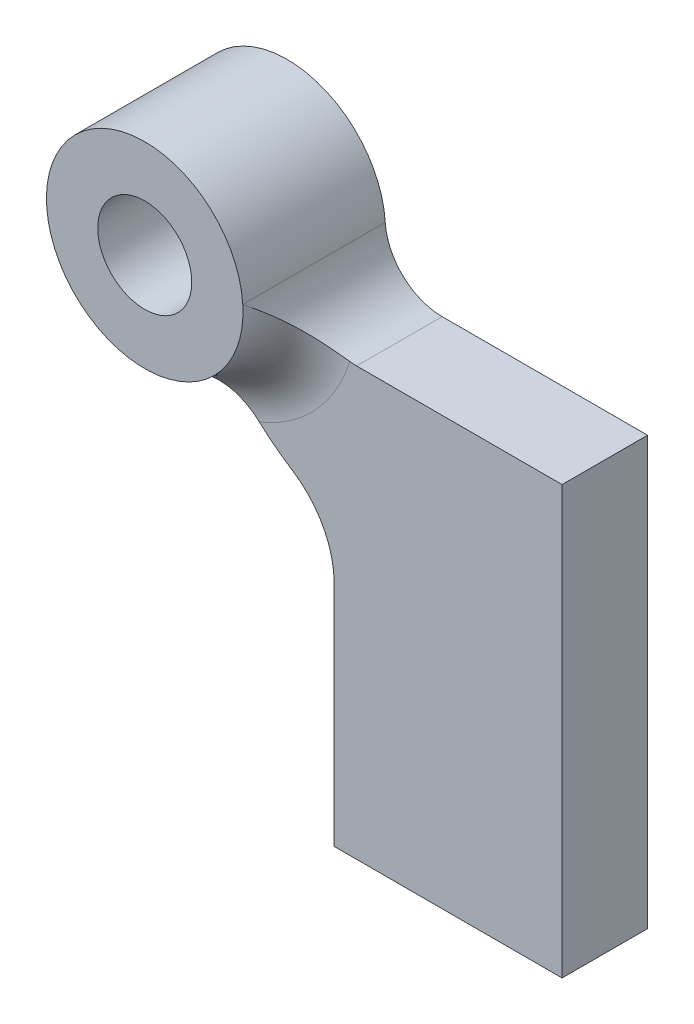
ISO-10303-21;
HEADER;
FILE_DESCRIPTION(('STEP AP214'),'2;1');
FILE_NAME('part.step','',(''),(''),'','','');
FILE_SCHEMA(('AUTOMOTIVE_DESIGN { 1 0 10303 214 1 1 1 1 }'));
ENDSEC;
DATA;
#1=APPLICATION_CONTEXT('core data for automotive mechanical design processes');
#2=APPLICATION_PROTOCOL_DEFINITION('international standard','automotive_design',2000,#1);
#3=PRODUCT_CONTEXT('',#1,'mechanical');
#4=PRODUCT('Part','Part','',(#3));
#5=PRODUCT_RELATED_PRODUCT_CATEGORY('part','',(#4));
#6=PRODUCT_DEFINITION_FORMATION('','',#4);
#7=PRODUCT_DEFINITION_CONTEXT('part definition',#1,'design');
#8=PRODUCT_DEFINITION('design','',#6,#7);
#9=PRODUCT_DEFINITION_SHAPE('','',#8);
#10=(LENGTH_UNIT() NAMED_UNIT(*) SI_UNIT(.MILLI.,.METRE.));
#11=(NAMED_UNIT(*) PLANE_ANGLE_UNIT() SI_UNIT($,.RADIAN.));
#12=(NAMED_UNIT(*) SI_UNIT($,.STERADIAN.) SOLID_ANGLE_UNIT());
#13=UNCERTAINTY_MEASURE_WITH_UNIT(LENGTH_MEASURE(1.E-05),#10,'distance_accuracy_value','');
#14=(GEOMETRIC_REPRESENTATION_CONTEXT(3) GLOBAL_UNCERTAINTY_ASSIGNED_CONTEXT((#13)) GLOBAL_UNIT_ASSIGNED_CONTEXT((#10,
#11,#12)) REPRESENTATION_CONTEXT('',''));
#15=CARTESIAN_POINT('',(0.,0.,0.));
#16=DIRECTION('',(0.,0.,1.));
#17=DIRECTION('',(1.,0.,0.));
#18=AXIS2_PLACEMENT_3D('',#15,#16,#17);
#19=CARTESIAN_POINT('',(0.,0.,5.));
#20=DIRECTION('',(0.,0.,1.));
#21=DIRECTION('',(1.,0.,0.));
#22=AXIS2_PLACEMENT_3D('',#19,#20,#21);
#23=PLANE('',#22);
#24=CARTESIAN_POINT('',(0.,0.,5.));
#25=DIRECTION('',(0.,0.,1.));
#26=DIRECTION('',(1.,0.,0.));
#27=AXIS2_PLACEMENT_3D('',#24,#25,#26);
#28=CIRCLE('',#27,3.45);
#29=CARTESIAN_POINT('',(3.44287834943564,0.221559633027522,5.));
#30=VERTEX_POINT('',#29);
#31=CARTESIAN_POINT('',(-0.221559633027523,-3.44287834943564,5.));
#32=VERTEX_POINT('',#31);
#33=EDGE_CURVE('E170',#30,#32,#28,.T.);
#34=ORIENTED_EDGE('',*,*,#33,.T.);
#35=EDGE_CURVE('E174',#32,#30,#28,.T.);
#36=ORIENTED_EDGE('',*,*,#35,.T.);
#37=EDGE_LOOP('',(#34,#36));
#38=FACE_BOUND('',#37,.T.);
#39=CARTESIAN_POINT('',(0.,0.,5.));
#40=DIRECTION('',(0.,0.,1.));
#41=DIRECTION('',(1.,0.,0.));
#42=AXIS2_PLACEMENT_3D('',#39,#40,#41);
#43=CIRCLE('',#42,1.65);
#44=CARTESIAN_POINT('',(1.65,0.,5.));
#45=VERTEX_POINT('',#44);
#46=EDGE_CURVE('E164',#45,#45,#43,.T.);
#47=ORIENTED_EDGE('',*,*,#46,.F.);
#48=EDGE_LOOP('',(#47));
#49=FACE_BOUND('',#48,.T.);
#50=ADVANCED_FACE('F35',(#38,#49),#23,.T.);
#51=CARTESIAN_POINT('',(0.,0.,0.));
#52=DIRECTION('',(0.,0.,1.));
#53=DIRECTION('',(1.,0.,0.));
#54=AXIS2_PLACEMENT_3D('',#51,#52,#53);
#55=PLANE('',#54);
#56=CARTESIAN_POINT('',(1.43131208582318,-8.65,0.));
#57=DIRECTION('',(0.,0.,-1.));
#58=DIRECTION('',(1.,0.,0.));
#59=AXIS2_PLACEMENT_3D('',#56,#57,#58);
#60=CIRCLE('',#59,3.21868791417682);
#61=CARTESIAN_POINT('',(3.15880428071859,-5.93417183801269,0.));
#62=VERTEX_POINT('',#61);
#63=CARTESIAN_POINT('',(4.65,-8.65,0.));
#64=VERTEX_POINT('',#63);
#65=EDGE_CURVE('E114',#62,#64,#60,.T.);
#66=ORIENTED_EDGE('',*,*,#65,.F.);
#67=CARTESIAN_POINT('',(7.45245993409614,0.815977873676602,0.));
#68=DIRECTION('',(0.,0.,1.));
#69=DIRECTION('',(1.,0.,0.));
#70=AXIS2_PLACEMENT_3D('',#67,#68,#69);
#71=CIRCLE('',#70,8.);
#72=CARTESIAN_POINT('',(1.21049198681923,-4.18780431034857,0.));
#73=VERTEX_POINT('',#72);
#74=EDGE_CURVE('E219',#62,#73,#71,.F.);
#75=ORIENTED_EDGE('',*,*,#74,.T.);
#76=CARTESIAN_POINT('',(-0.35,-5.43874985635486,0.));
#77=DIRECTION('',(0.,0.,1.));
#78=DIRECTION('',(1.,0.,0.));
#79=AXIS2_PLACEMENT_3D('',#76,#77,#78);
#80=CIRCLE('',#79,2.);
#81=CARTESIAN_POINT('',(-0.221559633027523,-3.44287834943564,0.));
#82=VERTEX_POINT('',#81);
#83=EDGE_CURVE('E189',#73,#82,#80,.T.);
#84=ORIENTED_EDGE('',*,*,#83,.T.);
#85=CARTESIAN_POINT('',(0.,0.,0.));
#86=DIRECTION('',(0.,0.,1.));
#87=DIRECTION('',(1.,0.,0.));
#88=AXIS2_PLACEMENT_3D('',#85,#86,#87);
#89=CIRCLE('',#88,3.45);
#90=CARTESIAN_POINT('',(3.44287834943564,0.221559633027522,0.));
#91=VERTEX_POINT('',#90);
#92=EDGE_CURVE('E167',#91,#82,#89,.T.);
#93=ORIENTED_EDGE('',*,*,#92,.F.);
#94=CARTESIAN_POINT('',(5.43874985635486,0.349999999999999,0.));
#95=DIRECTION('',(0.,0.,1.));
#96=DIRECTION('',(1.,0.,0.));
#97=AXIS2_PLACEMENT_3D('',#94,#95,#96);
#98=CIRCLE('',#97,2.);
#99=CARTESIAN_POINT('',(5.43874985635486,-1.65,0.));
#100=VERTEX_POINT('',#99);
#101=EDGE_CURVE('E184',#91,#100,#98,.T.);
#102=ORIENTED_EDGE('',*,*,#101,.T.);
#103=DIRECTION('',(1.,0.,0.));
#104=VECTOR('',#103,1.);
#105=CARTESIAN_POINT('',(0.,-1.65,0.));
#106=LINE('',#105,#104);
#107=CARTESIAN_POINT('',(12.65,-1.65,0.));
#108=VERTEX_POINT('',#107);
#109=EDGE_CURVE('E152',#100,#108,#106,.T.);
#110=ORIENTED_EDGE('',*,*,#109,.T.);
#111=DIRECTION('',(0.,-1.,0.));
#112=VECTOR('',#111,1.);
#113=CARTESIAN_POINT('',(12.65,0.,0.));
#114=LINE('',#113,#112);
#115=CARTESIAN_POINT('',(12.65,-16.65,0.));
#116=VERTEX_POINT('',#115);
#117=EDGE_CURVE('E154',#108,#116,#114,.T.);
#118=ORIENTED_EDGE('',*,*,#117,.T.);
#119=DIRECTION('',(1.,0.,0.));
#120=VECTOR('',#119,1.);
#121=CARTESIAN_POINT('',(0.,-16.65,0.));
#122=LINE('',#121,#120);
#123=CARTESIAN_POINT('',(4.65,-16.65,0.));
#124=VERTEX_POINT('',#123);
#125=EDGE_CURVE('E137',#124,#116,#122,.T.);
#126=ORIENTED_EDGE('',*,*,#125,.F.);
#127=DIRECTION('',(0.,-1.,0.));
#128=VECTOR('',#127,1.);
#129=CARTESIAN_POINT('',(4.65,-16.65,0.));
#130=LINE('',#129,#128);
#131=EDGE_CURVE('E123',#64,#124,#130,.T.);
#132=ORIENTED_EDGE('',*,*,#131,.F.);
#133=EDGE_LOOP('',(#66,#75,#84,#93,#102,#110,#118,#126,#132));
#134=FACE_BOUND('',#133,.T.);
#135=CARTESIAN_POINT('',(0.,0.,0.));
#136=DIRECTION('',(0.,0.,1.));
#137=DIRECTION('',(1.,0.,0.));
#138=AXIS2_PLACEMENT_3D('',#135,#136,#137);
#139=CIRCLE('',#138,1.65);
#140=CARTESIAN_POINT('',(1.65,0.,0.));
#141=VERTEX_POINT('',#140);
#142=EDGE_CURVE('E161',#141,#141,#139,.T.);
#143=ORIENTED_EDGE('',*,*,#142,.T.);
#144=EDGE_LOOP('',(#143));
#145=FACE_BOUND('',#144,.T.);
#146=ADVANCED_FACE('F134',(#134,#145),#55,.F.);
#147=CARTESIAN_POINT('',(0.,0.,5.));
#148=DIRECTION('',(0.,0.,-1.));
#149=DIRECTION('',(-1.,0.,0.));
#150=AXIS2_PLACEMENT_3D('',#147,#148,#149);
#151=CYLINDRICAL_SURFACE('',#150,3.45);
#152=ORIENTED_EDGE('',*,*,#33,.F.);
#153=DIRECTION('',(0.,0.,-1.));
#154=VECTOR('',#153,1.);
#155=CARTESIAN_POINT('',(3.44287834943565,0.221559633027523,5.));
#156=LINE('',#155,#154);
#157=EDGE_CURVE('E180',#30,#91,#156,.T.);
#158=ORIENTED_EDGE('',*,*,#157,.T.);
#159=ORIENTED_EDGE('',*,*,#92,.T.);
#160=DIRECTION('',(0.,0.,-1.));
#161=VECTOR('',#160,1.);
#162=CARTESIAN_POINT('',(-0.221559633027523,-3.44287834943565,5.));
#163=LINE('',#162,#161);
#164=EDGE_CURVE('E178',#82,#32,#163,.F.);
#165=ORIENTED_EDGE('',*,*,#164,.T.);
#166=EDGE_LOOP('',(#152,#158,#159,#165));
#167=FACE_BOUND('',#166,.T.);
#168=ADVANCED_FACE('F248',(#167),#151,.T.);
#169=CARTESIAN_POINT('',(0.,0.,5.));
#170=DIRECTION('',(0.,0.,-1.));
#171=DIRECTION('',(-1.,0.,0.));
#172=AXIS2_PLACEMENT_3D('',#169,#170,#171);
#173=CYLINDRICAL_SURFACE('',#172,1.65);
#174=ORIENTED_EDGE('',*,*,#46,.T.);
#175=EDGE_LOOP('',(#174));
#176=FACE_BOUND('',#175,.T.);
#177=ORIENTED_EDGE('',*,*,#142,.F.);
#178=EDGE_LOOP('',(#177));
#179=FACE_BOUND('',#178,.T.);
#180=ADVANCED_FACE('F255',(#176,#179),#173,.F.);
#181=CARTESIAN_POINT('',(0.,-1.65,3.));
#182=DIRECTION('',(0.,1.,0.));
#183=DIRECTION('',(-1.,0.,0.));
#184=AXIS2_PLACEMENT_3D('',#181,#182,#183);
#185=PLANE('',#184);
#186=ORIENTED_EDGE('',*,*,#109,.F.);
#187=DIRECTION('',(0.,0.,-1.));
#188=VECTOR('',#187,1.);
#189=CARTESIAN_POINT('',(5.43874985635486,-1.65,3.));
#190=LINE('',#189,#188);
#191=CARTESIAN_POINT('',(5.43874985635486,-1.65,3.));
#192=VERTEX_POINT('',#191);
#193=EDGE_CURVE('E182',#100,#192,#190,.F.);
#194=ORIENTED_EDGE('',*,*,#193,.T.);
#195=DIRECTION('',(1.,0.,0.));
#196=VECTOR('',#195,1.);
#197=CARTESIAN_POINT('',(0.,-1.65,3.));
#198=LINE('',#197,#196);
#199=CARTESIAN_POINT('',(12.65,-1.65,3.));
#200=VERTEX_POINT('',#199);
#201=EDGE_CURVE('E144',#192,#200,#198,.T.);
#202=ORIENTED_EDGE('',*,*,#201,.T.);
#203=DIRECTION('',(0.,0.,-1.));
#204=VECTOR('',#203,1.);
#205=CARTESIAN_POINT('',(12.65,-1.65,3.));
#206=LINE('',#205,#204);
#207=EDGE_CURVE('E151',#200,#108,#206,.T.);
#208=ORIENTED_EDGE('',*,*,#207,.T.);
#209=EDGE_LOOP('',(#186,#194,#202,#208));
#210=FACE_BOUND('',#209,.T.);
#211=ADVANCED_FACE('F258',(#210),#185,.T.);
#212=CARTESIAN_POINT('',(0.,-16.65,3.));
#213=DIRECTION('',(0.,1.,0.));
#214=DIRECTION('',(0.,0.,1.));
#215=AXIS2_PLACEMENT_3D('',#212,#213,#214);
#216=PLANE('',#215);
#217=DIRECTION('',(1.,0.,0.));
#218=VECTOR('',#217,1.);
#219=CARTESIAN_POINT('',(0.,-16.65,3.));
#220=LINE('',#219,#218);
#221=CARTESIAN_POINT('',(4.65,-16.65,3.));
#222=VERTEX_POINT('',#221);
#223=CARTESIAN_POINT('',(12.65,-16.65,3.));
#224=VERTEX_POINT('',#223);
#225=EDGE_CURVE('E149',#222,#224,#220,.T.);
#226=ORIENTED_EDGE('',*,*,#225,.F.);
#227=DIRECTION('',(0.,0.,-1.));
#228=VECTOR('',#227,1.);
#229=CARTESIAN_POINT('',(4.65,-16.65,5.18220762382919));
#230=LINE('',#229,#228);
#231=EDGE_CURVE('E131',#222,#124,#230,.T.);
#232=ORIENTED_EDGE('',*,*,#231,.T.);
#233=ORIENTED_EDGE('',*,*,#125,.T.);
#234=DIRECTION('',(0.,0.,-1.));
#235=VECTOR('',#234,1.);
#236=CARTESIAN_POINT('',(12.65,-16.65,3.));
#237=LINE('',#236,#235);
#238=EDGE_CURVE('E158',#224,#116,#237,.T.);
#239=ORIENTED_EDGE('',*,*,#238,.F.);
#240=EDGE_LOOP('',(#226,#232,#233,#239));
#241=FACE_BOUND('',#240,.T.);
#242=ADVANCED_FACE('F227',(#241),#216,.F.);
#243=CARTESIAN_POINT('',(12.65,0.,3.));
#244=DIRECTION('',(1.,0.,0.));
#245=DIRECTION('',(0.,0.,-1.));
#246=AXIS2_PLACEMENT_3D('',#243,#244,#245);
#247=PLANE('',#246);
#248=ORIENTED_EDGE('',*,*,#117,.F.);
#249=ORIENTED_EDGE('',*,*,#207,.F.);
#250=DIRECTION('',(0.,-1.,0.));
#251=VECTOR('',#250,1.);
#252=CARTESIAN_POINT('',(12.65,0.,3.));
#253=LINE('',#252,#251);
#254=EDGE_CURVE('E146',#200,#224,#253,.T.);
#255=ORIENTED_EDGE('',*,*,#254,.T.);
#256=ORIENTED_EDGE('',*,*,#238,.T.);
#257=EDGE_LOOP('',(#248,#249,#255,#256));
#258=FACE_BOUND('',#257,.T.);
#259=ADVANCED_FACE('F231',(#258),#247,.T.);
#260=CARTESIAN_POINT('',(0.,0.,3.));
#261=DIRECTION('',(0.,0.,-1.));
#262=DIRECTION('',(-1.,0.,0.));
#263=AXIS2_PLACEMENT_3D('',#260,#261,#262);
#264=PLANE('',#263);
#265=CARTESIAN_POINT('',(0.,0.,3.));
#266=DIRECTION('',(0.,0.,-1.));
#267=DIRECTION('',(-1.,0.,0.));
#268=AXIS2_PLACEMENT_3D('',#265,#266,#267);
#269=CIRCLE('',#268,5.45);
#270=CARTESIAN_POINT('',(5.19879464316531,-1.6355531963821,3.));
#271=VERTEX_POINT('',#270);
#272=CARTESIAN_POINT('',(2.02387093093095,-5.06028126243321,3.));
#273=VERTEX_POINT('',#272);
#274=EDGE_CURVE('E173',#271,#273,#269,.T.);
#275=ORIENTED_EDGE('',*,*,#274,.T.);
#276=CARTESIAN_POINT('',(7.45245993409614,0.815977873676602,3.));
#277=DIRECTION('',(0.,0.,-1.));
#278=DIRECTION('',(-1.,0.,0.));
#279=AXIS2_PLACEMENT_3D('',#276,#277,#278);
#280=CIRCLE('',#279,8.);
#281=CARTESIAN_POINT('',(3.15880428071859,-5.93417183801269,3.));
#282=VERTEX_POINT('',#281);
#283=EDGE_CURVE('E11',#273,#282,#280,.F.);
#284=ORIENTED_EDGE('',*,*,#283,.T.);
#285=CARTESIAN_POINT('',(1.43131208582318,-8.65,3.));
#286=DIRECTION('',(0.,0.,-1.));
#287=DIRECTION('',(-1.,0.,0.));
#288=AXIS2_PLACEMENT_3D('',#285,#286,#287);
#289=CIRCLE('',#288,3.21868791417682);
#290=CARTESIAN_POINT('',(4.65,-8.65,3.));
#291=VERTEX_POINT('',#290);
#292=EDGE_CURVE('E140',#282,#291,#289,.T.);
#293=ORIENTED_EDGE('',*,*,#292,.T.);
#294=DIRECTION('',(0.,-1.,0.));
#295=VECTOR('',#294,1.);
#296=CARTESIAN_POINT('',(4.65,0.,3.));
#297=LINE('',#296,#295);
#298=EDGE_CURVE('E130',#291,#222,#297,.T.);
#299=ORIENTED_EDGE('',*,*,#298,.T.);
#300=ORIENTED_EDGE('',*,*,#225,.T.);
#301=ORIENTED_EDGE('',*,*,#254,.F.);
#302=ORIENTED_EDGE('',*,*,#201,.F.);
#303=CARTESIAN_POINT('',(5.43874985635486,0.349999999999999,3.));
#304=DIRECTION('',(0.,0.,-1.));
#305=DIRECTION('',(-1.,0.,0.));
#306=AXIS2_PLACEMENT_3D('',#303,#304,#305);
#307=CIRCLE('',#306,2.);
#308=EDGE_CURVE('E186',#192,#271,#307,.T.);
#309=ORIENTED_EDGE('',*,*,#308,.T.);
#310=EDGE_LOOP('',(#275,#284,#293,#299,#300,#301,#302,#309));
#311=FACE_BOUND('',#310,.T.);
#312=ADVANCED_FACE('F223',(#311),#264,.F.);
#313=CARTESIAN_POINT('',(5.43874985635486,0.349999999999999,5.));
#314=DIRECTION('',(0.,0.,-1.));
#315=DIRECTION('',(-1.,0.,0.));
#316=AXIS2_PLACEMENT_3D('',#313,#314,#315);
#317=CYLINDRICAL_SURFACE('',#316,2.);
#318=ORIENTED_EDGE('',*,*,#101,.F.);
#319=ORIENTED_EDGE('',*,*,#157,.F.);
#320=CARTESIAN_POINT('',(5.19879464316531,-1.6355531963821,3.));
#321=CARTESIAN_POINT('',(5.15601586947662,-1.63039343002128,2.99999105611133));
#322=CARTESIAN_POINT('',(5.1134068605461,-1.62383169645634,3.00134524287717));
#323=CARTESIAN_POINT('',(5.0288834620299,-1.60802119495143,3.00680646296391));
#324=CARTESIAN_POINT('',(4.9869688535809,-1.59877329135902,3.0109126113218));
#325=CARTESIAN_POINT('',(4.904447926687,-1.57777678730503,3.02186626704254));
#326=CARTESIAN_POINT('',(4.86383456191017,-1.566045934893,3.02869460716958));
#327=CARTESIAN_POINT('',(4.78393122597814,-1.54023236211942,3.04504267324058));
#328=CARTESIAN_POINT('',(4.74464126605692,-1.52614962179945,3.05456242202463));
#329=CARTESIAN_POINT('',(4.62922817132232,-1.48070568274044,3.08702865317063));
#330=CARTESIAN_POINT('',(4.55542122610988,-1.44611214418716,3.11390097472523));
#331=CARTESIAN_POINT('',(4.41558261979615,-1.37031695354548,3.1768997874176));
#332=CARTESIAN_POINT('',(4.34956189346957,-1.3291061956432,3.21303907213342));
#333=CARTESIAN_POINT('',(4.20369078562573,-1.22644370782066,3.3073653488076));
#334=CARTESIAN_POINT('',(4.12734231119697,-1.16302507608707,3.36881464228935));
#335=CARTESIAN_POINT('',(3.98931659999737,-1.03141067271512,3.50223942327968));
#336=CARTESIAN_POINT('',(3.92767617683656,-0.963203455868827,3.57424061021429));
#337=CARTESIAN_POINT('',(3.82982477844873,-0.839994677246547,3.70873304033871));
#338=CARTESIAN_POINT('',(3.79100715985244,-0.785430016592932,3.76977774012891));
#339=CARTESIAN_POINT('',(3.72047111532476,-0.675565051727981,3.89525544402255));
#340=CARTESIAN_POINT('',(3.68875662534219,-0.620264357560002,3.95969030236472));
#341=CARTESIAN_POINT('',(3.6316837920825,-0.509306404163932,4.09108333438981));
#342=CARTESIAN_POINT('',(3.60633055802722,-0.453648894908586,4.1580434870004));
#343=CARTESIAN_POINT('',(3.56139271383643,-0.342198276095605,4.29374430319088));
#344=CARTESIAN_POINT('',(3.54180831092374,-0.286405161739449,4.36248503063452));
#345=CARTESIAN_POINT('',(3.50235992946247,-0.156372937449637,4.52397503274654));
#346=CARTESIAN_POINT('',(3.48451985566214,-0.0820984767886451,4.61718920075452));
#347=CARTESIAN_POINT('',(3.45747333449348,0.0667045894948929,4.80460909897305));
#348=CARTESIAN_POINT('',(3.44826404165266,0.141233103220233,4.8988144920224));
#349=CARTESIAN_POINT('',(3.44311935625157,0.217854961128561,4.99533388544067));
#350=CARTESIAN_POINT('',(3.44299756860831,0.21970722229371,4.99766695260125));
#351=CARTESIAN_POINT('',(3.44287834943564,0.221559633027522,5.));
#352=B_SPLINE_CURVE_WITH_KNOTS('',3,(#320,#321,#322,#323,#324,#325,#326,#327,#328,#329,#330,
#331,#332,#333,#334,#335,#336,#337,#338,#339,#340,#341,#342,#343,#344,#345,#346,#347,#348,#349,
#350,#351),.UNSPECIFIED.,.F.,.F.,(4,2,2,2,2,2,2,2,2,2,2,2,2,2,2,4),(0.,0.129220740946311,
0.25839994761389,0.386685215574848,0.514971572235337,0.771110862318624,1.02760568940098,
1.37586000109253,1.7249770432187,1.99644658738673,2.26806618672633,2.53990325162982,
2.81175008003159,3.17294929389797,3.53402938246517,3.54297365773464),.UNSPECIFIED.);
#353=EDGE_CURVE('E155',#271,#30,#352,.T.);
#354=ORIENTED_EDGE('',*,*,#353,.F.);
#355=ORIENTED_EDGE('',*,*,#308,.F.);
#356=ORIENTED_EDGE('',*,*,#193,.F.);
#357=EDGE_LOOP('',(#318,#319,#354,#355,#356));
#358=FACE_BOUND('',#357,.T.);
#359=ADVANCED_FACE('F209',(#358),#317,.F.);
#360=CARTESIAN_POINT('',(-0.35,-5.43874985635486,5.));
#361=DIRECTION('',(0.,0.,-1.));
#362=DIRECTION('',(-1.,0.,0.));
#363=AXIS2_PLACEMENT_3D('',#360,#361,#362);
#364=CYLINDRICAL_SURFACE('',#363,2.);
#365=ORIENTED_EDGE('',*,*,#83,.F.);
#366=DIRECTION('',(0.,0.,-1.));
#367=VECTOR('',#366,1.);
#368=CARTESIAN_POINT('',(1.21049198681923,-4.18780431034857,5.));
#369=LINE('',#368,#367);
#370=CARTESIAN_POINT('',(1.21049198682188,-4.18780431035185,3.32362049915097));
#371=VERTEX_POINT('',#370);
#372=EDGE_CURVE('E58',#73,#371,#369,.F.);
#373=ORIENTED_EDGE('',*,*,#372,.T.);
#374=CARTESIAN_POINT('',(1.6355531963821,-5.19879464316531,3.));
#375=CARTESIAN_POINT('',(1.63039343002128,-5.15601586947662,2.99999105611133));
#376=CARTESIAN_POINT('',(1.62383169645634,-5.1134068605461,3.00134524287717));
#377=CARTESIAN_POINT('',(1.60802119495142,-5.0288834620299,3.00680646296391));
#378=CARTESIAN_POINT('',(1.59877329135902,-4.98696885358089,3.0109126113218));
#379=CARTESIAN_POINT('',(1.57777678730503,-4.904447926687,3.02186626704254));
#380=CARTESIAN_POINT('',(1.566045934893,-4.86383456191017,3.02869460716958));
#381=CARTESIAN_POINT('',(1.54023236211942,-4.78393122597814,3.04504267324058));
#382=CARTESIAN_POINT('',(1.52614962179945,-4.74464126605692,3.05456242202463));
#383=CARTESIAN_POINT('',(1.48070568274043,-4.62922817132232,3.08702865317063));
#384=CARTESIAN_POINT('',(1.44611214418716,-4.55542122610989,3.11390097472523));
#385=CARTESIAN_POINT('',(1.37031695354548,-4.41558261979615,3.1768997874176));
#386=CARTESIAN_POINT('',(1.3291061956432,-4.34956189346957,3.21303907213342));
#387=CARTESIAN_POINT('',(1.22644370782066,-4.20369078562572,3.3073653488076));
#388=CARTESIAN_POINT('',(1.16302507608706,-4.12734231119696,3.36881464228936));
#389=CARTESIAN_POINT('',(1.03141067271511,-3.98931659999737,3.50223942327968));
#390=CARTESIAN_POINT('',(0.963203455868822,-3.92767617683656,3.57424061021429));
#391=CARTESIAN_POINT('',(0.839994677246548,-3.82982477844874,3.70873304033871));
#392=CARTESIAN_POINT('',(0.785430016592937,-3.79100715985244,3.7697777401289));
#393=CARTESIAN_POINT('',(0.675565051727992,-3.72047111532477,3.89525544402253));
#394=CARTESIAN_POINT('',(0.620264357560014,-3.6887566253422,3.95969030236469));
#395=CARTESIAN_POINT('',(0.509306404163959,-3.63168379208251,4.09108333438979));
#396=CARTESIAN_POINT('',(0.453648894908628,-3.60633055802723,4.15804348700039));
#397=CARTESIAN_POINT('',(0.342198276095594,-3.56139271383643,4.29374430319085));
#398=CARTESIAN_POINT('',(0.286405161739371,-3.54180831092374,4.36248503063445));
#399=CARTESIAN_POINT('',(0.156372937449743,-3.50235992946247,4.52397503274663));
#400=CARTESIAN_POINT('',(0.0820984767891104,-3.48451985566217,4.6171892007549));
#401=CARTESIAN_POINT('',(-0.0667045894953688,-3.45747333449345,4.80460909897267));
#402=CARTESIAN_POINT('',(-0.14123310322201,-3.44826404165255,4.89881449202099));
#403=CARTESIAN_POINT('',(-0.217854961128648,-3.44311935625157,4.9953338854406));
#404=CARTESIAN_POINT('',(-0.219707222293755,-3.44299756860831,4.99766695260121));
#405=CARTESIAN_POINT('',(-0.221559633027523,-3.44287834943564,5.));
#406=B_SPLINE_CURVE_WITH_KNOTS('',3,(#374,#375,#376,#377,#378,#379,#380,#381,#382,#383,#384,
#385,#386,#387,#388,#389,#390,#391,#392,#393,#394,#395,#396,#397,#398,#399,#400,#401,#402,#403,
#404,#405),.UNSPECIFIED.,.F.,.F.,(4,2,2,2,2,2,2,2,2,2,2,2,2,2,2,4),(0.,0.129220740946315,
0.258399947613896,0.386685215574851,0.514971572235338,0.771110862318619,1.02760568940098,
1.37586000109255,1.7249770432187,1.99644658738672,2.26806618672629,2.53990325162979,
2.81175008003159,3.17294929389797,3.53402938246517,3.54297365773464),.UNSPECIFIED.);
#407=EDGE_CURVE('E143',#32,#371,#406,.F.);
#408=ORIENTED_EDGE('',*,*,#407,.F.);
#409=ORIENTED_EDGE('',*,*,#164,.F.);
#410=EDGE_LOOP('',(#365,#373,#408,#409));
#411=FACE_BOUND('',#410,.T.);
#412=ADVANCED_FACE('F203',(#411),#364,.F.);
#413=CARTESIAN_POINT('',(0.,0.,5.));
#414=DIRECTION('',(0.,0.,-1.));
#415=DIRECTION('',(-1.,0.,0.));
#416=AXIS2_PLACEMENT_3D('',#413,#414,#415);
#417=TOROIDAL_SURFACE('',#416,5.45,2.);
#418=ORIENTED_EDGE('',*,*,#407,.T.);
#419=CARTESIAN_POINT('',(1.21049198681923,-4.18780431034857,3.32362049914492));
#420=CARTESIAN_POINT('',(1.2443605264643,-4.23005769836794,3.29109201647123));
#421=CARTESIAN_POINT('',(1.27952922769609,-4.27304425963252,3.26095382196727));
#422=CARTESIAN_POINT('',(1.35230684777889,-4.36005791877442,3.20553485442382));
#423=CARTESIAN_POINT('',(1.3899153942301,-4.4040848572072,3.18025334241901));
#424=CARTESIAN_POINT('',(1.50435542633862,-4.53502347351465,3.11286776619467));
#425=CARTESIAN_POINT('',(1.58440991894655,-4.62281860368921,3.0776927390613));
#426=CARTESIAN_POINT('',(1.72401478333242,-4.76896416506481,3.0347698172186));
#427=CARTESIAN_POINT('',(1.78176513369049,-4.82760366155817,3.02182229681579));
#428=CARTESIAN_POINT('',(1.90062255655197,-4.94459662627739,3.00437149004172));
#429=CARTESIAN_POINT('',(1.96176792476604,-5.00293138239051,3.00000299913645));
#430=CARTESIAN_POINT('',(2.02387093093095,-5.06028126243321,3.));
#431=B_SPLINE_CURVE_WITH_KNOTS('',3,(#419,#420,#421,#422,#423,#424,#425,#426,#427,#428,#429,
#430),.UNSPECIFIED.,.F.,.F.,(4,2,2,2,2,4),(0.,0.189367511393624,0.378706186837312,
0.74848481684148,0.997990404939323,1.25138586939236),.UNSPECIFIED.);
#432=EDGE_CURVE('E44',#371,#273,#431,.T.);
#433=ORIENTED_EDGE('',*,*,#432,.T.);
#434=ORIENTED_EDGE('',*,*,#274,.F.);
#435=ORIENTED_EDGE('',*,*,#353,.T.);
#436=ORIENTED_EDGE('',*,*,#35,.F.);
#437=EDGE_LOOP('',(#418,#433,#434,#435,#436));
#438=FACE_BOUND('',#437,.T.);
#439=ADVANCED_FACE('F206',(#438),#417,.F.);
#440=CARTESIAN_POINT('',(4.65,-16.65,5.18220762382919));
#441=DIRECTION('',(1.,0.,0.));
#442=DIRECTION('',(0.,0.,-1.));
#443=AXIS2_PLACEMENT_3D('',#440,#441,#442);
#444=PLANE('',#443);
#445=DIRECTION('',(0.,0.,-1.));
#446=VECTOR('',#445,1.);
#447=CARTESIAN_POINT('',(4.65,-8.65,5.18220762382919));
#448=LINE('',#447,#446);
#449=EDGE_CURVE('E118',#291,#64,#448,.T.);
#450=ORIENTED_EDGE('',*,*,#449,.T.);
#451=ORIENTED_EDGE('',*,*,#131,.T.);
#452=ORIENTED_EDGE('',*,*,#231,.F.);
#453=ORIENTED_EDGE('',*,*,#298,.F.);
#454=EDGE_LOOP('',(#450,#451,#452,#453));
#455=FACE_BOUND('',#454,.T.);
#456=ADVANCED_FACE('F127',(#455),#444,.F.);
#457=CARTESIAN_POINT('',(1.43131208582318,-8.65,5.18220762382919));
#458=DIRECTION('',(0.,0.,-1.));
#459=DIRECTION('',(-1.,0.,0.));
#460=AXIS2_PLACEMENT_3D('',#457,#458,#459);
#461=CYLINDRICAL_SURFACE('',#460,3.21868791417682);
#462=ORIENTED_EDGE('',*,*,#292,.F.);
#463=DIRECTION('',(0.,0.,-1.));
#464=VECTOR('',#463,1.);
#465=CARTESIAN_POINT('',(3.15880428071859,-5.93417183801269,5.18220762382919));
#466=LINE('',#465,#464);
#467=EDGE_CURVE('E120',#282,#62,#466,.T.);
#468=ORIENTED_EDGE('',*,*,#467,.T.);
#469=ORIENTED_EDGE('',*,*,#65,.T.);
#470=ORIENTED_EDGE('',*,*,#449,.F.);
#471=EDGE_LOOP('',(#462,#468,#469,#470));
#472=FACE_BOUND('',#471,.T.);
#473=ADVANCED_FACE('F117',(#472),#461,.F.);
#474=CARTESIAN_POINT('',(7.45245993409614,0.815977873676602,5.));
#475=DIRECTION('',(0.,0.,-1.));
#476=DIRECTION('',(-1.,0.,0.));
#477=AXIS2_PLACEMENT_3D('',#474,#475,#476);
#478=CYLINDRICAL_SURFACE('',#477,8.);
#479=ORIENTED_EDGE('',*,*,#432,.F.);
#480=ORIENTED_EDGE('',*,*,#372,.F.);
#481=ORIENTED_EDGE('',*,*,#74,.F.);
#482=ORIENTED_EDGE('',*,*,#467,.F.);
#483=ORIENTED_EDGE('',*,*,#283,.F.);
#484=EDGE_LOOP('',(#479,#480,#481,#482,#483));
#485=FACE_BOUND('',#484,.T.);
#486=ADVANCED_FACE('F37',(#485),#478,.T.);
#487=CLOSED_SHELL('',(#50,#146,#168,#180,#211,#242,#259,#312,#359,#412,#439,#456,#473,#486));
#488=MANIFOLD_SOLID_BREP('B2',#487);
#489=ADVANCED_BREP_SHAPE_REPRESENTATION('',(#18,#488),#14);
#490=SHAPE_DEFINITION_REPRESENTATION(#9,#489);
ENDSEC;
END-ISO-10303-21;
